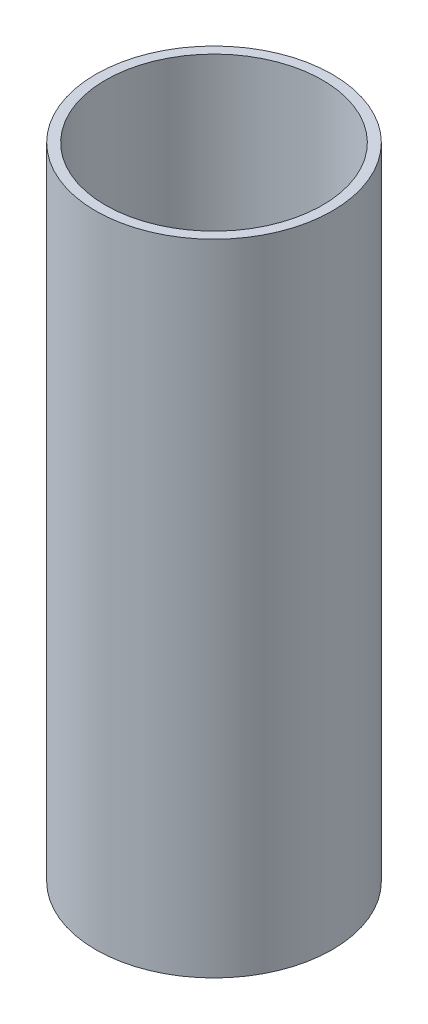
ISO-10303-21;
HEADER;
FILE_DESCRIPTION(('STEP AP214'),'2;1');
FILE_NAME('part.step','',(''),(''),'','','');
FILE_SCHEMA(('AUTOMOTIVE_DESIGN { 1 0 10303 214 1 1 1 1 }'));
ENDSEC;
DATA;
#1=APPLICATION_CONTEXT('core data for automotive mechanical design processes');
#2=APPLICATION_PROTOCOL_DEFINITION('international standard','automotive_design',2000,#1);
#3=PRODUCT_CONTEXT('',#1,'mechanical');
#4=PRODUCT('Part','Part','',(#3));
#5=PRODUCT_RELATED_PRODUCT_CATEGORY('part','',(#4));
#6=PRODUCT_DEFINITION_FORMATION('','',#4);
#7=PRODUCT_DEFINITION_CONTEXT('part definition',#1,'design');
#8=PRODUCT_DEFINITION('design','',#6,#7);
#9=PRODUCT_DEFINITION_SHAPE('','',#8);
#10=(LENGTH_UNIT() NAMED_UNIT(*) SI_UNIT(.MILLI.,.METRE.));
#11=(NAMED_UNIT(*) PLANE_ANGLE_UNIT() SI_UNIT($,.RADIAN.));
#12=(NAMED_UNIT(*) SI_UNIT($,.STERADIAN.) SOLID_ANGLE_UNIT());
#13=UNCERTAINTY_MEASURE_WITH_UNIT(LENGTH_MEASURE(1.E-05),#10,'distance_accuracy_value','');
#14=(GEOMETRIC_REPRESENTATION_CONTEXT(3) GLOBAL_UNCERTAINTY_ASSIGNED_CONTEXT((#13)) GLOBAL_UNIT_ASSIGNED_CONTEXT((#10,
#11,#12)) REPRESENTATION_CONTEXT('',''));
#15=CARTESIAN_POINT('',(0.,0.,0.));
#16=DIRECTION('',(0.,0.,1.));
#17=DIRECTION('',(1.,0.,0.));
#18=AXIS2_PLACEMENT_3D('',#15,#16,#17);
#19=CARTESIAN_POINT('',(0.,412.,0.));
#20=DIRECTION('',(0.,1.,0.));
#21=DIRECTION('',(0.,0.,1.));
#22=AXIS2_PLACEMENT_3D('',#19,#20,#21);
#23=PLANE('',#22);
#24=CARTESIAN_POINT('',(0.,412.,0.));
#25=DIRECTION('',(0.,1.,0.));
#26=DIRECTION('',(0.,0.,1.));
#27=AXIS2_PLACEMENT_3D('',#24,#25,#26);
#28=CIRCLE('',#27,76.2);
#29=CARTESIAN_POINT('',(0.,412.,76.2));
#30=VERTEX_POINT('',#29);
#31=EDGE_CURVE('E10',#30,#30,#28,.T.);
#32=ORIENTED_EDGE('',*,*,#31,.T.);
#33=EDGE_LOOP('',(#32));
#34=FACE_BOUND('',#33,.T.);
#35=CARTESIAN_POINT('',(0.,412.,0.));
#36=DIRECTION('',(0.,1.,0.));
#37=DIRECTION('',(0.,0.,1.));
#38=AXIS2_PLACEMENT_3D('',#35,#36,#37);
#39=CIRCLE('',#38,69.85);
#40=CARTESIAN_POINT('',(0.,412.,69.85));
#41=VERTEX_POINT('',#40);
#42=EDGE_CURVE('E47',#41,#41,#39,.T.);
#43=ORIENTED_EDGE('',*,*,#42,.F.);
#44=EDGE_LOOP('',(#43));
#45=FACE_BOUND('',#44,.T.);
#46=ADVANCED_FACE('F36',(#34,#45),#23,.T.);
#47=CARTESIAN_POINT('',(0.,0.,0.));
#48=DIRECTION('',(0.,1.,0.));
#49=DIRECTION('',(0.,0.,1.));
#50=AXIS2_PLACEMENT_3D('',#47,#48,#49);
#51=PLANE('',#50);
#52=CARTESIAN_POINT('',(0.,0.,0.));
#53=DIRECTION('',(0.,1.,0.));
#54=DIRECTION('',(0.,0.,1.));
#55=AXIS2_PLACEMENT_3D('',#52,#53,#54);
#56=CIRCLE('',#55,76.2);
#57=CARTESIAN_POINT('',(0.,0.,76.2));
#58=VERTEX_POINT('',#57);
#59=EDGE_CURVE('E40',#58,#58,#56,.T.);
#60=ORIENTED_EDGE('',*,*,#59,.F.);
#61=EDGE_LOOP('',(#60));
#62=FACE_BOUND('',#61,.T.);
#63=CARTESIAN_POINT('',(0.,0.,0.));
#64=DIRECTION('',(0.,1.,0.));
#65=DIRECTION('',(0.,0.,1.));
#66=AXIS2_PLACEMENT_3D('',#63,#64,#65);
#67=CIRCLE('',#66,69.85);
#68=CARTESIAN_POINT('',(0.,0.,69.85));
#69=VERTEX_POINT('',#68);
#70=EDGE_CURVE('E49',#69,#69,#67,.T.);
#71=ORIENTED_EDGE('',*,*,#70,.T.);
#72=EDGE_LOOP('',(#71));
#73=FACE_BOUND('',#72,.T.);
#74=ADVANCED_FACE('F59',(#62,#73),#51,.F.);
#75=CARTESIAN_POINT('',(0.,412.,0.));
#76=DIRECTION('',(0.,-1.,0.));
#77=DIRECTION('',(0.,0.,-1.));
#78=AXIS2_PLACEMENT_3D('',#75,#76,#77);
#79=CYLINDRICAL_SURFACE('',#78,76.2);
#80=ORIENTED_EDGE('',*,*,#31,.F.);
#81=EDGE_LOOP('',(#80));
#82=FACE_BOUND('',#81,.T.);
#83=ORIENTED_EDGE('',*,*,#59,.T.);
#84=EDGE_LOOP('',(#83));
#85=FACE_BOUND('',#84,.T.);
#86=ADVANCED_FACE('F38',(#82,#85),#79,.T.);
#87=CARTESIAN_POINT('',(0.,412.,0.));
#88=DIRECTION('',(0.,-1.,0.));
#89=DIRECTION('',(0.,0.,-1.));
#90=AXIS2_PLACEMENT_3D('',#87,#88,#89);
#91=CYLINDRICAL_SURFACE('',#90,69.85);
#92=ORIENTED_EDGE('',*,*,#42,.T.);
#93=EDGE_LOOP('',(#92));
#94=FACE_BOUND('',#93,.T.);
#95=ORIENTED_EDGE('',*,*,#70,.F.);
#96=EDGE_LOOP('',(#95));
#97=FACE_BOUND('',#96,.T.);
#98=ADVANCED_FACE('F55',(#94,#97),#91,.F.);
#99=CLOSED_SHELL('',(#46,#74,#86,#98));
#100=MANIFOLD_SOLID_BREP('B2',#99);
#101=ADVANCED_BREP_SHAPE_REPRESENTATION('',(#18,#100),#14);
#102=SHAPE_DEFINITION_REPRESENTATION(#9,#101);
ENDSEC;
END-ISO-10303-21;
